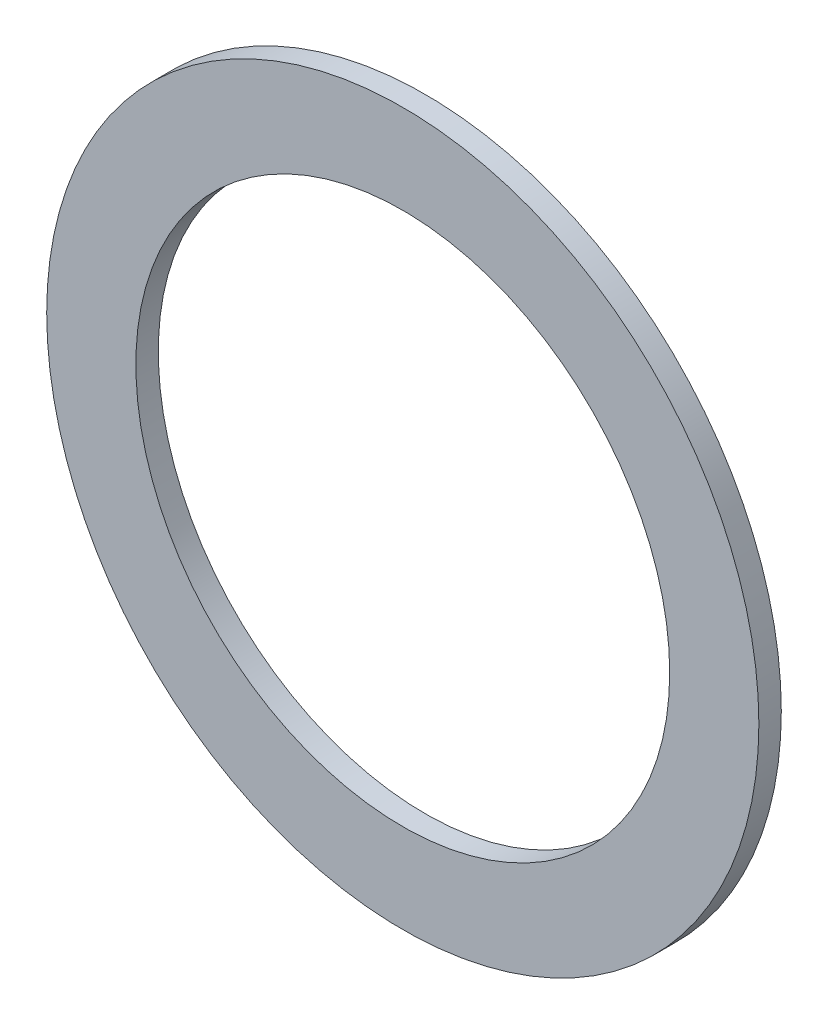
ISO-10303-21;
HEADER;
FILE_DESCRIPTION(('STEP AP214'),'2;1');
FILE_NAME('part.step','',(''),(''),'','','');
FILE_SCHEMA(('AUTOMOTIVE_DESIGN { 1 0 10303 214 1 1 1 1 }'));
ENDSEC;
DATA;
#1=APPLICATION_CONTEXT('core data for automotive mechanical design processes');
#2=APPLICATION_PROTOCOL_DEFINITION('international standard','automotive_design',2000,#1);
#3=PRODUCT_CONTEXT('',#1,'mechanical');
#4=PRODUCT('Part','Part','',(#3));
#5=PRODUCT_RELATED_PRODUCT_CATEGORY('part','',(#4));
#6=PRODUCT_DEFINITION_FORMATION('','',#4);
#7=PRODUCT_DEFINITION_CONTEXT('part definition',#1,'design');
#8=PRODUCT_DEFINITION('design','',#6,#7);
#9=PRODUCT_DEFINITION_SHAPE('','',#8);
#10=(LENGTH_UNIT() NAMED_UNIT(*) SI_UNIT(.MILLI.,.METRE.));
#11=(NAMED_UNIT(*) PLANE_ANGLE_UNIT() SI_UNIT($,.RADIAN.));
#12=(NAMED_UNIT(*) SI_UNIT($,.STERADIAN.) SOLID_ANGLE_UNIT());
#13=UNCERTAINTY_MEASURE_WITH_UNIT(LENGTH_MEASURE(1.E-05),#10,'distance_accuracy_value','');
#14=(GEOMETRIC_REPRESENTATION_CONTEXT(3) GLOBAL_UNCERTAINTY_ASSIGNED_CONTEXT((#13)) GLOBAL_UNIT_ASSIGNED_CONTEXT((#10,
#11,#12)) REPRESENTATION_CONTEXT('',''));
#15=CARTESIAN_POINT('',(0.,0.,0.));
#16=DIRECTION('',(0.,0.,1.));
#17=DIRECTION('',(1.,0.,0.));
#18=AXIS2_PLACEMENT_3D('',#15,#16,#17);
#19=CARTESIAN_POINT('',(0.,0.,0.2));
#20=DIRECTION('',(0.,0.,-1.));
#21=DIRECTION('',(-1.,0.,0.));
#22=AXIS2_PLACEMENT_3D('',#19,#20,#21);
#23=CYLINDRICAL_SURFACE('',#22,3.175);
#24=CARTESIAN_POINT('',(0.,0.,0.));
#25=DIRECTION('',(0.,0.,-1.));
#26=DIRECTION('',(-1.,0.,0.));
#27=AXIS2_PLACEMENT_3D('',#24,#25,#26);
#28=CIRCLE('',#27,3.175);
#29=CARTESIAN_POINT('',(-3.175,0.,0.));
#30=VERTEX_POINT('',#29);
#31=EDGE_CURVE('E19',#30,#30,#28,.F.);
#32=ORIENTED_EDGE('',*,*,#31,.T.);
#33=EDGE_LOOP('',(#32));
#34=FACE_BOUND('',#33,.T.);
#35=CARTESIAN_POINT('',(0.,0.,0.2));
#36=DIRECTION('',(0.,0.,-1.));
#37=DIRECTION('',(-1.,0.,0.));
#38=AXIS2_PLACEMENT_3D('',#35,#36,#37);
#39=CIRCLE('',#38,3.175);
#40=CARTESIAN_POINT('',(-3.175,0.,0.2));
#41=VERTEX_POINT('',#40);
#42=EDGE_CURVE('E28',#41,#41,#39,.F.);
#43=ORIENTED_EDGE('',*,*,#42,.F.);
#44=EDGE_LOOP('',(#43));
#45=FACE_BOUND('',#44,.T.);
#46=ADVANCED_FACE('F15',(#34,#45),#23,.T.);
#47=CARTESIAN_POINT('',(-3.2131,-3.2131,0.));
#48=DIRECTION('',(0.,0.,1.));
#49=DIRECTION('',(1.,0.,0.));
#50=AXIS2_PLACEMENT_3D('',#47,#48,#49);
#51=PLANE('',#50);
#52=CARTESIAN_POINT('',(0.,0.,0.));
#53=DIRECTION('',(0.,0.,1.));
#54=DIRECTION('',(1.,0.,0.));
#55=AXIS2_PLACEMENT_3D('',#52,#53,#54);
#56=CIRCLE('',#55,2.38);
#57=CARTESIAN_POINT('',(2.38,0.,0.));
#58=VERTEX_POINT('',#57);
#59=EDGE_CURVE('E23',#58,#58,#56,.F.);
#60=ORIENTED_EDGE('',*,*,#59,.F.);
#61=EDGE_LOOP('',(#60));
#62=FACE_BOUND('',#61,.T.);
#63=ORIENTED_EDGE('',*,*,#31,.F.);
#64=EDGE_LOOP('',(#63));
#65=FACE_BOUND('',#64,.T.);
#66=ADVANCED_FACE('F38',(#62,#65),#51,.F.);
#67=CARTESIAN_POINT('',(-3.2131,-3.2131,0.2));
#68=DIRECTION('',(0.,0.,1.));
#69=DIRECTION('',(1.,0.,0.));
#70=AXIS2_PLACEMENT_3D('',#67,#68,#69);
#71=PLANE('',#70);
#72=CARTESIAN_POINT('',(0.,0.,0.2));
#73=DIRECTION('',(0.,0.,1.));
#74=DIRECTION('',(1.,0.,0.));
#75=AXIS2_PLACEMENT_3D('',#72,#73,#74);
#76=CIRCLE('',#75,2.38);
#77=CARTESIAN_POINT('',(2.38,0.,0.2));
#78=VERTEX_POINT('',#77);
#79=EDGE_CURVE('E10',#78,#78,#76,.T.);
#80=ORIENTED_EDGE('',*,*,#79,.F.);
#81=EDGE_LOOP('',(#80));
#82=FACE_BOUND('',#81,.T.);
#83=ORIENTED_EDGE('',*,*,#42,.T.);
#84=EDGE_LOOP('',(#83));
#85=FACE_BOUND('',#84,.T.);
#86=ADVANCED_FACE('F17',(#82,#85),#71,.T.);
#87=CARTESIAN_POINT('',(0.,0.,0.));
#88=DIRECTION('',(0.,0.,1.));
#89=DIRECTION('',(1.,0.,0.));
#90=AXIS2_PLACEMENT_3D('',#87,#88,#89);
#91=CYLINDRICAL_SURFACE('',#90,2.38);
#92=ORIENTED_EDGE('',*,*,#59,.T.);
#93=EDGE_LOOP('',(#92));
#94=FACE_BOUND('',#93,.T.);
#95=ORIENTED_EDGE('',*,*,#79,.T.);
#96=EDGE_LOOP('',(#95));
#97=FACE_BOUND('',#96,.T.);
#98=ADVANCED_FACE('F46',(#94,#97),#91,.F.);
#99=CLOSED_SHELL('',(#46,#66,#86,#98));
#100=MANIFOLD_SOLID_BREP('B1',#99);
#101=ADVANCED_BREP_SHAPE_REPRESENTATION('',(#18,#100),#14);
#102=SHAPE_DEFINITION_REPRESENTATION(#9,#101);
ENDSEC;
END-ISO-10303-21;
